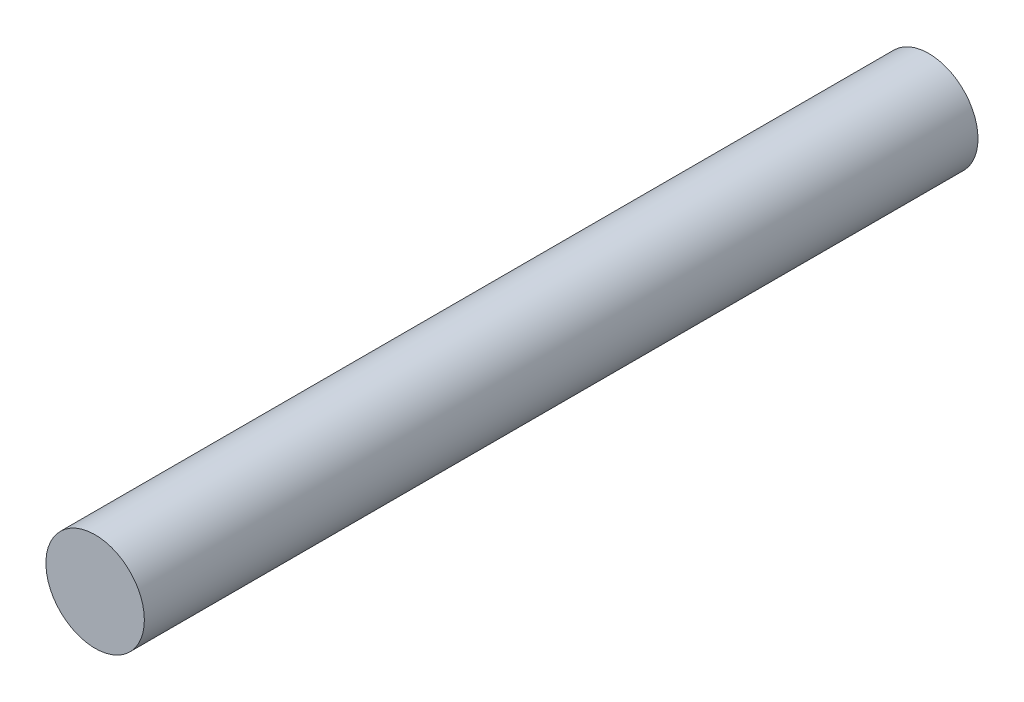
ISO-10303-21;
HEADER;
FILE_DESCRIPTION(('STEP AP214'),'2;1');
FILE_NAME('part.step','',(''),(''),'','','');
FILE_SCHEMA(('AUTOMOTIVE_DESIGN { 1 0 10303 214 1 1 1 1 }'));
ENDSEC;
DATA;
#1=APPLICATION_CONTEXT('core data for automotive mechanical design processes');
#2=APPLICATION_PROTOCOL_DEFINITION('international standard','automotive_design',2000,#1);
#3=PRODUCT_CONTEXT('',#1,'mechanical');
#4=PRODUCT('Part','Part','',(#3));
#5=PRODUCT_RELATED_PRODUCT_CATEGORY('part','',(#4));
#6=PRODUCT_DEFINITION_FORMATION('','',#4);
#7=PRODUCT_DEFINITION_CONTEXT('part definition',#1,'design');
#8=PRODUCT_DEFINITION('design','',#6,#7);
#9=PRODUCT_DEFINITION_SHAPE('','',#8);
#10=(LENGTH_UNIT() NAMED_UNIT(*) SI_UNIT(.MILLI.,.METRE.));
#11=(NAMED_UNIT(*) PLANE_ANGLE_UNIT() SI_UNIT($,.RADIAN.));
#12=(NAMED_UNIT(*) SI_UNIT($,.STERADIAN.) SOLID_ANGLE_UNIT());
#13=UNCERTAINTY_MEASURE_WITH_UNIT(LENGTH_MEASURE(1.E-05),#10,'distance_accuracy_value','');
#14=(GEOMETRIC_REPRESENTATION_CONTEXT(3) GLOBAL_UNCERTAINTY_ASSIGNED_CONTEXT((#13)) GLOBAL_UNIT_ASSIGNED_CONTEXT((#10,
#11,#12)) REPRESENTATION_CONTEXT('',''));
#15=CARTESIAN_POINT('',(0.,0.,0.));
#16=DIRECTION('',(0.,0.,1.));
#17=DIRECTION('',(1.,0.,0.));
#18=AXIS2_PLACEMENT_3D('',#15,#16,#17);
#19=CARTESIAN_POINT('',(0.,0.,50.8));
#20=DIRECTION('',(0.,0.,-1.));
#21=DIRECTION('',(-1.,0.,0.));
#22=AXIS2_PLACEMENT_3D('',#19,#20,#21);
#23=CYLINDRICAL_SURFACE('',#22,3.);
#24=CARTESIAN_POINT('',(0.,0.,50.8));
#25=DIRECTION('',(0.,0.,1.));
#26=DIRECTION('',(1.,0.,0.));
#27=AXIS2_PLACEMENT_3D('',#24,#25,#26);
#28=CIRCLE('',#27,3.);
#29=CARTESIAN_POINT('',(3.,0.,50.8));
#30=VERTEX_POINT('',#29);
#31=EDGE_CURVE('E10',#30,#30,#28,.T.);
#32=ORIENTED_EDGE('',*,*,#31,.F.);
#33=EDGE_LOOP('',(#32));
#34=FACE_BOUND('',#33,.T.);
#35=CARTESIAN_POINT('',(0.,0.,0.));
#36=DIRECTION('',(0.,0.,1.));
#37=DIRECTION('',(1.,0.,0.));
#38=AXIS2_PLACEMENT_3D('',#35,#36,#37);
#39=CIRCLE('',#38,3.);
#40=CARTESIAN_POINT('',(3.,0.,0.));
#41=VERTEX_POINT('',#40);
#42=EDGE_CURVE('E34',#41,#41,#39,.T.);
#43=ORIENTED_EDGE('',*,*,#42,.T.);
#44=EDGE_LOOP('',(#43));
#45=FACE_BOUND('',#44,.T.);
#46=ADVANCED_FACE('F31',(#34,#45),#23,.T.);
#47=CARTESIAN_POINT('',(0.,0.,50.8));
#48=DIRECTION('',(0.,0.,1.));
#49=DIRECTION('',(1.,0.,0.));
#50=AXIS2_PLACEMENT_3D('',#47,#48,#49);
#51=PLANE('',#50);
#52=ORIENTED_EDGE('',*,*,#31,.T.);
#53=EDGE_LOOP('',(#52));
#54=FACE_BOUND('',#53,.T.);
#55=ADVANCED_FACE('F46',(#54),#51,.T.);
#56=CARTESIAN_POINT('',(0.,0.,0.));
#57=DIRECTION('',(0.,0.,1.));
#58=DIRECTION('',(1.,0.,0.));
#59=AXIS2_PLACEMENT_3D('',#56,#57,#58);
#60=PLANE('',#59);
#61=ORIENTED_EDGE('',*,*,#42,.F.);
#62=EDGE_LOOP('',(#61));
#63=FACE_BOUND('',#62,.T.);
#64=ADVANCED_FACE('F44',(#63),#60,.F.);
#65=CLOSED_SHELL('',(#46,#55,#64));
#66=MANIFOLD_SOLID_BREP('B2',#65);
#67=ADVANCED_BREP_SHAPE_REPRESENTATION('',(#18,#66),#14);
#68=SHAPE_DEFINITION_REPRESENTATION(#9,#67);
ENDSEC;
END-ISO-10303-21;
